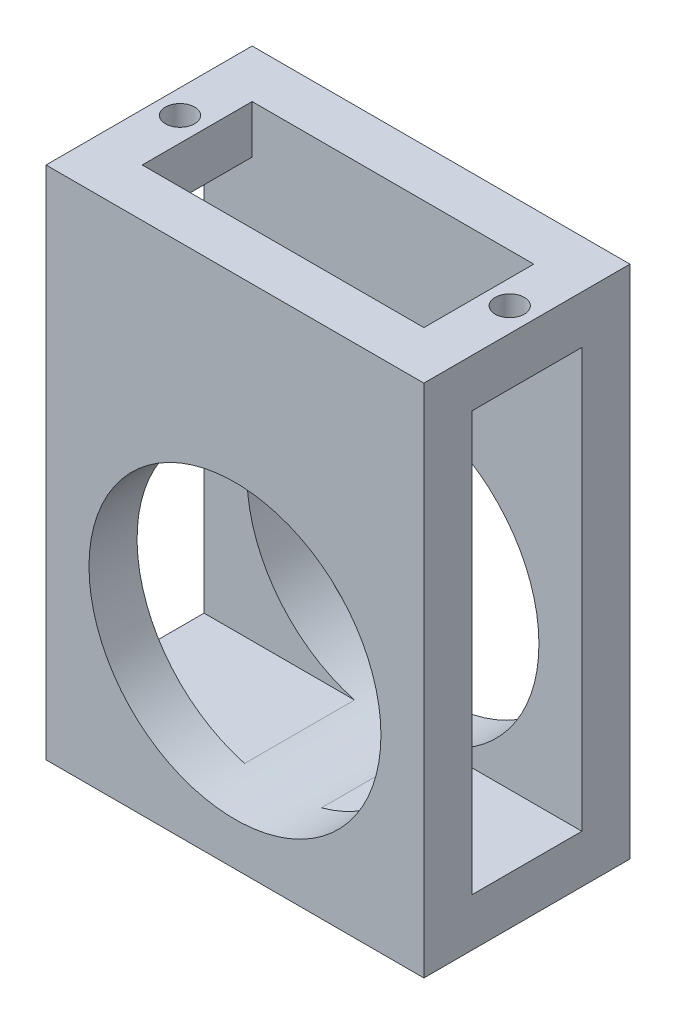
ISO-10303-21;
HEADER;
FILE_DESCRIPTION(('STEP AP214'),'2;1');
FILE_NAME('part.step','',(''),(''),'','','');
FILE_SCHEMA(('AUTOMOTIVE_DESIGN { 1 0 10303 214 1 1 1 1 }'));
ENDSEC;
DATA;
#1=APPLICATION_CONTEXT('core data for automotive mechanical design processes');
#2=APPLICATION_PROTOCOL_DEFINITION('international standard','automotive_design',2000,#1);
#3=PRODUCT_CONTEXT('',#1,'mechanical');
#4=PRODUCT('Part','Part','',(#3));
#5=PRODUCT_RELATED_PRODUCT_CATEGORY('part','',(#4));
#6=PRODUCT_DEFINITION_FORMATION('','',#4);
#7=PRODUCT_DEFINITION_CONTEXT('part definition',#1,'design');
#8=PRODUCT_DEFINITION('design','',#6,#7);
#9=PRODUCT_DEFINITION_SHAPE('','',#8);
#10=(LENGTH_UNIT() NAMED_UNIT(*) SI_UNIT(.MILLI.,.METRE.));
#11=(NAMED_UNIT(*) PLANE_ANGLE_UNIT() SI_UNIT($,.RADIAN.));
#12=(NAMED_UNIT(*) SI_UNIT($,.STERADIAN.) SOLID_ANGLE_UNIT());
#13=UNCERTAINTY_MEASURE_WITH_UNIT(LENGTH_MEASURE(1.E-05),#10,'distance_accuracy_value','');
#14=(GEOMETRIC_REPRESENTATION_CONTEXT(3) GLOBAL_UNCERTAINTY_ASSIGNED_CONTEXT((#13)) GLOBAL_UNIT_ASSIGNED_CONTEXT((#10,
#11,#12)) REPRESENTATION_CONTEXT('',''));
#15=CARTESIAN_POINT('',(0.,0.,0.));
#16=DIRECTION('',(0.,0.,1.));
#17=DIRECTION('',(1.,0.,0.));
#18=AXIS2_PLACEMENT_3D('',#15,#16,#17);
#19=CARTESIAN_POINT('',(-27.5,47.5,30.));
#20=DIRECTION('',(1.,0.,0.));
#21=DIRECTION('',(0.,1.,0.));
#22=AXIS2_PLACEMENT_3D('',#19,#20,#21);
#23=PLANE('',#22);
#24=DIRECTION('',(0.,0.,1.));
#25=VECTOR('',#24,1.);
#26=CARTESIAN_POINT('',(-27.5,40.5,30.));
#27=LINE('',#26,#25);
#28=CARTESIAN_POINT('',(-27.5,40.5,7.));
#29=VERTEX_POINT('',#28);
#30=CARTESIAN_POINT('',(-27.5,40.5,23.));
#31=VERTEX_POINT('',#30);
#32=EDGE_CURVE('E197',#29,#31,#27,.T.);
#33=ORIENTED_EDGE('',*,*,#32,.T.);
#34=DIRECTION('',(0.,-1.,0.));
#35=VECTOR('',#34,1.);
#36=CARTESIAN_POINT('',(-27.5,47.5,23.));
#37=LINE('',#36,#35);
#38=CARTESIAN_POINT('',(-27.5,-20.5,23.));
#39=VERTEX_POINT('',#38);
#40=EDGE_CURVE('E205',#31,#39,#37,.T.);
#41=ORIENTED_EDGE('',*,*,#40,.T.);
#42=DIRECTION('',(0.,0.,-1.));
#43=VECTOR('',#42,1.);
#44=CARTESIAN_POINT('',(-27.5,-20.5,30.));
#45=LINE('',#44,#43);
#46=CARTESIAN_POINT('',(-27.5,-20.5,6.99999999999999));
#47=VERTEX_POINT('',#46);
#48=EDGE_CURVE('E209',#39,#47,#45,.T.);
#49=ORIENTED_EDGE('',*,*,#48,.T.);
#50=DIRECTION('',(0.,1.,0.));
#51=VECTOR('',#50,1.);
#52=CARTESIAN_POINT('',(-27.5,47.5,7.));
#53=LINE('',#52,#51);
#54=EDGE_CURVE('E201',#47,#29,#53,.T.);
#55=ORIENTED_EDGE('',*,*,#54,.T.);
#56=EDGE_LOOP('',(#33,#41,#49,#55));
#57=FACE_BOUND('',#56,.T.);
#58=DIRECTION('',(0.,-1.,0.));
#59=VECTOR('',#58,1.);
#60=CARTESIAN_POINT('',(-27.5,47.5,0.));
#61=LINE('',#60,#59);
#62=CARTESIAN_POINT('',(-27.5,47.5,0.));
#63=VERTEX_POINT('',#62);
#64=CARTESIAN_POINT('',(-27.5,-27.5,0.));
#65=VERTEX_POINT('',#64);
#66=EDGE_CURVE('E246',#63,#65,#61,.T.);
#67=ORIENTED_EDGE('',*,*,#66,.T.);
#68=DIRECTION('',(0.,0.,-1.));
#69=VECTOR('',#68,1.);
#70=CARTESIAN_POINT('',(-27.5,-27.5,30.));
#71=LINE('',#70,#69);
#72=CARTESIAN_POINT('',(-27.5,-27.5,30.));
#73=VERTEX_POINT('',#72);
#74=EDGE_CURVE('E287',#73,#65,#71,.T.);
#75=ORIENTED_EDGE('',*,*,#74,.F.);
#76=DIRECTION('',(0.,-1.,0.));
#77=VECTOR('',#76,1.);
#78=CARTESIAN_POINT('',(-27.5,47.5,30.));
#79=LINE('',#78,#77);
#80=CARTESIAN_POINT('',(-27.5,47.5,30.));
#81=VERTEX_POINT('',#80);
#82=EDGE_CURVE('E250',#81,#73,#79,.T.);
#83=ORIENTED_EDGE('',*,*,#82,.F.);
#84=DIRECTION('',(0.,0.,-1.));
#85=VECTOR('',#84,1.);
#86=CARTESIAN_POINT('',(-27.5,47.5,30.));
#87=LINE('',#86,#85);
#88=EDGE_CURVE('E264',#81,#63,#87,.T.);
#89=ORIENTED_EDGE('',*,*,#88,.T.);
#90=EDGE_LOOP('',(#67,#75,#83,#89));
#91=FACE_BOUND('',#90,.T.);
#92=ADVANCED_FACE('F45',(#57,#91),#23,.F.);
#93=CARTESIAN_POINT('',(-27.5,-27.5,30.));
#94=DIRECTION('',(0.,1.,0.));
#95=DIRECTION('',(0.,0.,1.));
#96=AXIS2_PLACEMENT_3D('',#93,#94,#95);
#97=PLANE('',#96);
#98=DIRECTION('',(1.,0.,0.));
#99=VECTOR('',#98,1.);
#100=CARTESIAN_POINT('',(-27.5,-27.5,0.));
#101=LINE('',#100,#99);
#102=CARTESIAN_POINT('',(27.5,-27.5,0.));
#103=VERTEX_POINT('',#102);
#104=EDGE_CURVE('E268',#65,#103,#101,.T.);
#105=ORIENTED_EDGE('',*,*,#104,.T.);
#106=DIRECTION('',(0.,0.,-1.));
#107=VECTOR('',#106,1.);
#108=CARTESIAN_POINT('',(27.5,-27.5,30.));
#109=LINE('',#108,#107);
#110=CARTESIAN_POINT('',(27.5,-27.5,30.));
#111=VERTEX_POINT('',#110);
#112=EDGE_CURVE('E283',#111,#103,#109,.T.);
#113=ORIENTED_EDGE('',*,*,#112,.F.);
#114=DIRECTION('',(1.,0.,0.));
#115=VECTOR('',#114,1.);
#116=CARTESIAN_POINT('',(-27.5,-27.5,30.));
#117=LINE('',#116,#115);
#118=EDGE_CURVE('E254',#73,#111,#117,.T.);
#119=ORIENTED_EDGE('',*,*,#118,.F.);
#120=ORIENTED_EDGE('',*,*,#74,.T.);
#121=EDGE_LOOP('',(#105,#113,#119,#120));
#122=FACE_BOUND('',#121,.T.);
#123=ADVANCED_FACE('F344',(#122),#97,.F.);
#124=CARTESIAN_POINT('',(27.5,47.5,30.));
#125=DIRECTION('',(-1.,0.,0.));
#126=DIRECTION('',(0.,-1.,0.));
#127=AXIS2_PLACEMENT_3D('',#124,#125,#126);
#128=PLANE('',#127);
#129=DIRECTION('',(0.,0.,-1.));
#130=VECTOR('',#129,1.);
#131=CARTESIAN_POINT('',(27.5,-20.5,23.));
#132=LINE('',#131,#130);
#133=CARTESIAN_POINT('',(27.5,-20.5,23.));
#134=VERTEX_POINT('',#133);
#135=CARTESIAN_POINT('',(27.5,-20.5,6.99999999999999));
#136=VERTEX_POINT('',#135);
#137=EDGE_CURVE('E163',#134,#136,#132,.T.);
#138=ORIENTED_EDGE('',*,*,#137,.F.);
#139=DIRECTION('',(0.,-1.,0.));
#140=VECTOR('',#139,1.);
#141=CARTESIAN_POINT('',(27.5,40.5,23.));
#142=LINE('',#141,#140);
#143=CARTESIAN_POINT('',(27.5,40.5,23.));
#144=VERTEX_POINT('',#143);
#145=EDGE_CURVE('E70',#144,#134,#142,.T.);
#146=ORIENTED_EDGE('',*,*,#145,.F.);
#147=DIRECTION('',(0.,0.,1.));
#148=VECTOR('',#147,1.);
#149=CARTESIAN_POINT('',(27.5,40.5,23.));
#150=LINE('',#149,#148);
#151=CARTESIAN_POINT('',(27.5,40.5,7.));
#152=VERTEX_POINT('',#151);
#153=EDGE_CURVE('E172',#152,#144,#150,.T.);
#154=ORIENTED_EDGE('',*,*,#153,.F.);
#155=DIRECTION('',(0.,1.,0.));
#156=VECTOR('',#155,1.);
#157=CARTESIAN_POINT('',(27.5,40.5,7.));
#158=LINE('',#157,#156);
#159=EDGE_CURVE('E154',#136,#152,#158,.T.);
#160=ORIENTED_EDGE('',*,*,#159,.F.);
#161=EDGE_LOOP('',(#138,#146,#154,#160));
#162=FACE_BOUND('',#161,.T.);
#163=DIRECTION('',(0.,1.,0.));
#164=VECTOR('',#163,1.);
#165=CARTESIAN_POINT('',(27.5,47.5,0.));
#166=LINE('',#165,#164);
#167=CARTESIAN_POINT('',(27.5,47.5,0.));
#168=VERTEX_POINT('',#167);
#169=EDGE_CURVE('E271',#103,#168,#166,.T.);
#170=ORIENTED_EDGE('',*,*,#169,.T.);
#171=DIRECTION('',(0.,0.,-1.));
#172=VECTOR('',#171,1.);
#173=CARTESIAN_POINT('',(27.5,47.5,30.));
#174=LINE('',#173,#172);
#175=CARTESIAN_POINT('',(27.5,47.5,30.));
#176=VERTEX_POINT('',#175);
#177=EDGE_CURVE('E279',#176,#168,#174,.T.);
#178=ORIENTED_EDGE('',*,*,#177,.F.);
#179=DIRECTION('',(0.,1.,0.));
#180=VECTOR('',#179,1.);
#181=CARTESIAN_POINT('',(27.5,47.5,30.));
#182=LINE('',#181,#180);
#183=EDGE_CURVE('E258',#111,#176,#182,.T.);
#184=ORIENTED_EDGE('',*,*,#183,.F.);
#185=ORIENTED_EDGE('',*,*,#112,.T.);
#186=EDGE_LOOP('',(#170,#178,#184,#185));
#187=FACE_BOUND('',#186,.T.);
#188=ADVANCED_FACE('F169',(#162,#187),#128,.F.);
#189=CARTESIAN_POINT('',(-27.5,47.5,30.));
#190=DIRECTION('',(0.,-1.,0.));
#191=DIRECTION('',(0.,0.,-1.));
#192=AXIS2_PLACEMENT_3D('',#189,#190,#191);
#193=PLANE('',#192);
#194=CARTESIAN_POINT('',(-24.,47.5,14.));
#195=DIRECTION('',(0.,1.,0.));
#196=DIRECTION('',(0.,0.,1.));
#197=AXIS2_PLACEMENT_3D('',#194,#195,#196);
#198=CIRCLE('',#197,2.125);
#199=CARTESIAN_POINT('',(-24.,47.5,16.125));
#200=VERTEX_POINT('',#199);
#201=EDGE_CURVE('E301',#200,#200,#198,.T.);
#202=ORIENTED_EDGE('',*,*,#201,.F.);
#203=EDGE_LOOP('',(#202));
#204=FACE_BOUND('',#203,.T.);
#205=CARTESIAN_POINT('',(24.,47.5,14.));
#206=DIRECTION('',(0.,1.,0.));
#207=DIRECTION('',(0.,0.,1.));
#208=AXIS2_PLACEMENT_3D('',#205,#206,#207);
#209=CIRCLE('',#208,2.125);
#210=CARTESIAN_POINT('',(24.,47.5,16.125));
#211=VERTEX_POINT('',#210);
#212=EDGE_CURVE('E308',#211,#211,#209,.T.);
#213=ORIENTED_EDGE('',*,*,#212,.F.);
#214=EDGE_LOOP('',(#213));
#215=FACE_BOUND('',#214,.T.);
#216=DIRECTION('',(1.,0.,0.));
#217=VECTOR('',#216,1.);
#218=CARTESIAN_POINT('',(-20.5,47.5,23.));
#219=LINE('',#218,#217);
#220=CARTESIAN_POINT('',(-20.5,47.5,23.));
#221=VERTEX_POINT('',#220);
#222=CARTESIAN_POINT('',(20.5,47.5,23.));
#223=VERTEX_POINT('',#222);
#224=EDGE_CURVE('E217',#221,#223,#219,.T.);
#225=ORIENTED_EDGE('',*,*,#224,.F.);
#226=DIRECTION('',(0.,0.,1.));
#227=VECTOR('',#226,1.);
#228=CARTESIAN_POINT('',(-20.5,47.5,7.));
#229=LINE('',#228,#227);
#230=CARTESIAN_POINT('',(-20.5,47.5,7.));
#231=VERTEX_POINT('',#230);
#232=EDGE_CURVE('E213',#231,#221,#229,.T.);
#233=ORIENTED_EDGE('',*,*,#232,.F.);
#234=DIRECTION('',(-1.,0.,0.));
#235=VECTOR('',#234,1.);
#236=CARTESIAN_POINT('',(-20.5,47.5,7.));
#237=LINE('',#236,#235);
#238=CARTESIAN_POINT('',(20.5,47.5,7.));
#239=VERTEX_POINT('',#238);
#240=EDGE_CURVE('E225',#239,#231,#237,.T.);
#241=ORIENTED_EDGE('',*,*,#240,.F.);
#242=DIRECTION('',(0.,0.,-1.));
#243=VECTOR('',#242,1.);
#244=CARTESIAN_POINT('',(20.5,47.5,7.));
#245=LINE('',#244,#243);
#246=EDGE_CURVE('E221',#223,#239,#245,.T.);
#247=ORIENTED_EDGE('',*,*,#246,.F.);
#248=EDGE_LOOP('',(#225,#233,#241,#247));
#249=FACE_BOUND('',#248,.T.);
#250=DIRECTION('',(-1.,0.,0.));
#251=VECTOR('',#250,1.);
#252=CARTESIAN_POINT('',(-27.5,47.5,0.));
#253=LINE('',#252,#251);
#254=EDGE_CURVE('E255',#168,#63,#253,.T.);
#255=ORIENTED_EDGE('',*,*,#254,.T.);
#256=ORIENTED_EDGE('',*,*,#88,.F.);
#257=DIRECTION('',(-1.,0.,0.));
#258=VECTOR('',#257,1.);
#259=CARTESIAN_POINT('',(-27.5,47.5,30.));
#260=LINE('',#259,#258);
#261=EDGE_CURVE('E261',#176,#81,#260,.T.);
#262=ORIENTED_EDGE('',*,*,#261,.F.);
#263=ORIENTED_EDGE('',*,*,#177,.T.);
#264=EDGE_LOOP('',(#255,#256,#262,#263));
#265=FACE_BOUND('',#264,.T.);
#266=ADVANCED_FACE('F321',(#204,#215,#249,#265),#193,.F.);
#267=CARTESIAN_POINT('',(0.,0.,30.));
#268=DIRECTION('',(0.,0.,1.));
#269=DIRECTION('',(1.,0.,0.));
#270=AXIS2_PLACEMENT_3D('',#267,#268,#269);
#271=PLANE('',#270);
#272=CARTESIAN_POINT('',(0.,0.,30.));
#273=DIRECTION('',(0.,0.,1.));
#274=DIRECTION('',(1.,0.,0.));
#275=AXIS2_PLACEMENT_3D('',#272,#273,#274);
#276=CIRCLE('',#275,21.25);
#277=CARTESIAN_POINT('',(21.25,0.,30.));
#278=VERTEX_POINT('',#277);
#279=EDGE_CURVE('E233',#278,#278,#276,.T.);
#280=ORIENTED_EDGE('',*,*,#279,.F.);
#281=EDGE_LOOP('',(#280));
#282=FACE_BOUND('',#281,.T.);
#283=ORIENTED_EDGE('',*,*,#82,.T.);
#284=ORIENTED_EDGE('',*,*,#118,.T.);
#285=ORIENTED_EDGE('',*,*,#183,.T.);
#286=ORIENTED_EDGE('',*,*,#261,.T.);
#287=EDGE_LOOP('',(#283,#284,#285,#286));
#288=FACE_BOUND('',#287,.T.);
#289=ADVANCED_FACE('F324',(#282,#288),#271,.T.);
#290=CARTESIAN_POINT('',(0.,0.,0.));
#291=DIRECTION('',(0.,0.,1.));
#292=DIRECTION('',(1.,0.,0.));
#293=AXIS2_PLACEMENT_3D('',#290,#291,#292);
#294=PLANE('',#293);
#295=CARTESIAN_POINT('',(0.,0.,0.));
#296=DIRECTION('',(0.,0.,1.));
#297=DIRECTION('',(1.,0.,0.));
#298=AXIS2_PLACEMENT_3D('',#295,#296,#297);
#299=CIRCLE('',#298,21.25);
#300=CARTESIAN_POINT('',(21.25,0.,0.));
#301=VERTEX_POINT('',#300);
#302=EDGE_CURVE('E242',#301,#301,#299,.T.);
#303=ORIENTED_EDGE('',*,*,#302,.T.);
#304=EDGE_LOOP('',(#303));
#305=FACE_BOUND('',#304,.T.);
#306=ORIENTED_EDGE('',*,*,#66,.F.);
#307=ORIENTED_EDGE('',*,*,#254,.F.);
#308=ORIENTED_EDGE('',*,*,#169,.F.);
#309=ORIENTED_EDGE('',*,*,#104,.F.);
#310=EDGE_LOOP('',(#306,#307,#308,#309));
#311=FACE_BOUND('',#310,.T.);
#312=ADVANCED_FACE('F341',(#305,#311),#294,.F.);
#313=CARTESIAN_POINT('',(0.,0.,0.));
#314=DIRECTION('',(0.,0.,1.));
#315=DIRECTION('',(1.,0.,0.));
#316=AXIS2_PLACEMENT_3D('',#313,#314,#315);
#317=CYLINDRICAL_SURFACE('',#316,21.25);
#318=DIRECTION('',(0.,0.,1.));
#319=VECTOR('',#318,1.);
#320=CARTESIAN_POINT('',(-5.59575732139985,-20.5,0.));
#321=LINE('',#320,#319);
#322=CARTESIAN_POINT('',(-5.59575732139985,-20.5,6.99999999999999));
#323=VERTEX_POINT('',#322);
#324=CARTESIAN_POINT('',(-5.59575732139985,-20.5,23.));
#325=VERTEX_POINT('',#324);
#326=EDGE_CURVE('E54',#323,#325,#321,.T.);
#327=ORIENTED_EDGE('',*,*,#326,.T.);
#328=CARTESIAN_POINT('',(0.,0.,23.));
#329=DIRECTION('',(0.,0.,1.));
#330=DIRECTION('',(1.,0.,0.));
#331=AXIS2_PLACEMENT_3D('',#328,#329,#330);
#332=CIRCLE('',#331,21.25);
#333=CARTESIAN_POINT('',(5.59575732139985,-20.5,23.));
#334=VERTEX_POINT('',#333);
#335=EDGE_CURVE('E291',#325,#334,#332,.F.);
#336=ORIENTED_EDGE('',*,*,#335,.T.);
#337=DIRECTION('',(0.,0.,1.));
#338=VECTOR('',#337,1.);
#339=CARTESIAN_POINT('',(5.59575732139985,-20.5,0.));
#340=LINE('',#339,#338);
#341=CARTESIAN_POINT('',(5.59575732139985,-20.5,6.99999999999999));
#342=VERTEX_POINT('',#341);
#343=EDGE_CURVE('E11',#334,#342,#340,.F.);
#344=ORIENTED_EDGE('',*,*,#343,.T.);
#345=CARTESIAN_POINT('',(0.,0.,7.));
#346=DIRECTION('',(0.,0.,-1.));
#347=DIRECTION('',(-1.,0.,0.));
#348=AXIS2_PLACEMENT_3D('',#345,#346,#347);
#349=CIRCLE('',#348,21.25);
#350=EDGE_CURVE('E156',#342,#323,#349,.F.);
#351=ORIENTED_EDGE('',*,*,#350,.T.);
#352=EDGE_LOOP('',(#327,#336,#344,#351));
#353=FACE_BOUND('',#352,.T.);
#354=ORIENTED_EDGE('',*,*,#302,.F.);
#355=EDGE_LOOP('',(#354));
#356=FACE_BOUND('',#355,.T.);
#357=ORIENTED_EDGE('',*,*,#279,.T.);
#358=EDGE_LOOP('',(#357));
#359=FACE_BOUND('',#358,.T.);
#360=ADVANCED_FACE('F372',(#353,#356,#359),#317,.F.);
#361=CARTESIAN_POINT('',(-20.5,-12.5,23.));
#362=DIRECTION('',(0.,0.,1.));
#363=DIRECTION('',(1.,0.,0.));
#364=AXIS2_PLACEMENT_3D('',#361,#362,#363);
#365=PLANE('',#364);
#366=ORIENTED_EDGE('',*,*,#335,.F.);
#367=DIRECTION('',(1.,0.,0.));
#368=VECTOR('',#367,1.);
#369=CARTESIAN_POINT('',(-32.5,-20.5,23.));
#370=LINE('',#369,#368);
#371=EDGE_CURVE('E160',#39,#325,#370,.T.);
#372=ORIENTED_EDGE('',*,*,#371,.F.);
#373=ORIENTED_EDGE('',*,*,#40,.F.);
#374=DIRECTION('',(1.,0.,0.));
#375=VECTOR('',#374,1.);
#376=CARTESIAN_POINT('',(-32.5,40.5,23.));
#377=LINE('',#376,#375);
#378=CARTESIAN_POINT('',(-20.5,40.5,23.));
#379=VERTEX_POINT('',#378);
#380=EDGE_CURVE('E182',#31,#379,#377,.T.);
#381=ORIENTED_EDGE('',*,*,#380,.T.);
#382=DIRECTION('',(0.,1.,0.));
#383=VECTOR('',#382,1.);
#384=CARTESIAN_POINT('',(-20.5,-12.5,23.));
#385=LINE('',#384,#383);
#386=EDGE_CURVE('E229',#379,#221,#385,.T.);
#387=ORIENTED_EDGE('',*,*,#386,.T.);
#388=ORIENTED_EDGE('',*,*,#224,.T.);
#389=DIRECTION('',(0.,1.,0.));
#390=VECTOR('',#389,1.);
#391=CARTESIAN_POINT('',(20.5,-12.5,23.));
#392=LINE('',#391,#390);
#393=CARTESIAN_POINT('',(20.5,40.5,23.));
#394=VERTEX_POINT('',#393);
#395=EDGE_CURVE('E237',#394,#223,#392,.T.);
#396=ORIENTED_EDGE('',*,*,#395,.F.);
#397=EDGE_CURVE('E179',#394,#144,#377,.T.);
#398=ORIENTED_EDGE('',*,*,#397,.T.);
#399=ORIENTED_EDGE('',*,*,#145,.T.);
#400=EDGE_CURVE('E165',#334,#134,#370,.T.);
#401=ORIENTED_EDGE('',*,*,#400,.F.);
#402=EDGE_LOOP('',(#366,#372,#373,#381,#387,#388,#396,#398,#399,#401));
#403=FACE_BOUND('',#402,.T.);
#404=ADVANCED_FACE('F374',(#403),#365,.F.);
#405=CARTESIAN_POINT('',(-20.5,-12.5,7.));
#406=DIRECTION('',(0.,0.,-1.));
#407=DIRECTION('',(-1.,0.,0.));
#408=AXIS2_PLACEMENT_3D('',#405,#406,#407);
#409=PLANE('',#408);
#410=ORIENTED_EDGE('',*,*,#350,.F.);
#411=DIRECTION('',(1.,0.,0.));
#412=VECTOR('',#411,1.);
#413=CARTESIAN_POINT('',(-32.5,-20.5,6.99999999999999));
#414=LINE('',#413,#412);
#415=EDGE_CURVE('E150',#342,#136,#414,.T.);
#416=ORIENTED_EDGE('',*,*,#415,.T.);
#417=ORIENTED_EDGE('',*,*,#159,.T.);
#418=DIRECTION('',(1.,0.,0.));
#419=VECTOR('',#418,1.);
#420=CARTESIAN_POINT('',(-32.5,40.5,7.));
#421=LINE('',#420,#419);
#422=CARTESIAN_POINT('',(20.5,40.5,7.));
#423=VERTEX_POINT('',#422);
#424=EDGE_CURVE('E184',#423,#152,#421,.T.);
#425=ORIENTED_EDGE('',*,*,#424,.F.);
#426=DIRECTION('',(0.,1.,0.));
#427=VECTOR('',#426,1.);
#428=CARTESIAN_POINT('',(20.5,-12.5,7.));
#429=LINE('',#428,#427);
#430=EDGE_CURVE('E234',#423,#239,#429,.T.);
#431=ORIENTED_EDGE('',*,*,#430,.T.);
#432=ORIENTED_EDGE('',*,*,#240,.T.);
#433=DIRECTION('',(0.,1.,0.));
#434=VECTOR('',#433,1.);
#435=CARTESIAN_POINT('',(-20.5,-12.5,7.));
#436=LINE('',#435,#434);
#437=CARTESIAN_POINT('',(-20.5,40.5,7.));
#438=VERTEX_POINT('',#437);
#439=EDGE_CURVE('E230',#438,#231,#436,.T.);
#440=ORIENTED_EDGE('',*,*,#439,.F.);
#441=EDGE_CURVE('E183',#29,#438,#421,.T.);
#442=ORIENTED_EDGE('',*,*,#441,.F.);
#443=ORIENTED_EDGE('',*,*,#54,.F.);
#444=EDGE_CURVE('E62',#47,#323,#414,.T.);
#445=ORIENTED_EDGE('',*,*,#444,.T.);
#446=EDGE_LOOP('',(#410,#416,#417,#425,#431,#432,#440,#442,#443,#445));
#447=FACE_BOUND('',#446,.T.);
#448=ADVANCED_FACE('F152',(#447),#409,.F.);
#449=CARTESIAN_POINT('',(-20.5,-12.5,7.));
#450=DIRECTION('',(-1.,0.,0.));
#451=DIRECTION('',(0.,0.,1.));
#452=AXIS2_PLACEMENT_3D('',#449,#450,#451);
#453=PLANE('',#452);
#454=ORIENTED_EDGE('',*,*,#386,.F.);
#455=DIRECTION('',(0.,0.,-1.));
#456=VECTOR('',#455,1.);
#457=CARTESIAN_POINT('',(-20.5,40.5,7.));
#458=LINE('',#457,#456);
#459=EDGE_CURVE('E193',#379,#438,#458,.T.);
#460=ORIENTED_EDGE('',*,*,#459,.T.);
#461=ORIENTED_EDGE('',*,*,#439,.T.);
#462=ORIENTED_EDGE('',*,*,#232,.T.);
#463=EDGE_LOOP('',(#454,#460,#461,#462));
#464=FACE_BOUND('',#463,.T.);
#465=ADVANCED_FACE('F380',(#464),#453,.F.);
#466=CARTESIAN_POINT('',(20.5,-12.5,7.));
#467=DIRECTION('',(1.,0.,0.));
#468=DIRECTION('',(0.,0.,-1.));
#469=AXIS2_PLACEMENT_3D('',#466,#467,#468);
#470=PLANE('',#469);
#471=ORIENTED_EDGE('',*,*,#430,.F.);
#472=DIRECTION('',(0.,0.,1.));
#473=VECTOR('',#472,1.);
#474=CARTESIAN_POINT('',(20.5,40.5,7.));
#475=LINE('',#474,#473);
#476=EDGE_CURVE('E189',#423,#394,#475,.T.);
#477=ORIENTED_EDGE('',*,*,#476,.T.);
#478=ORIENTED_EDGE('',*,*,#395,.T.);
#479=ORIENTED_EDGE('',*,*,#246,.T.);
#480=EDGE_LOOP('',(#471,#477,#478,#479));
#481=FACE_BOUND('',#480,.T.);
#482=ADVANCED_FACE('F385',(#481),#470,.F.);
#483=CARTESIAN_POINT('',(-32.5,40.5,23.));
#484=DIRECTION('',(0.,1.,0.));
#485=DIRECTION('',(-1.,0.,0.));
#486=AXIS2_PLACEMENT_3D('',#483,#484,#485);
#487=PLANE('',#486);
#488=CARTESIAN_POINT('',(24.,40.5,14.));
#489=DIRECTION('',(0.,1.,0.));
#490=DIRECTION('',(-1.,0.,0.));
#491=AXIS2_PLACEMENT_3D('',#488,#489,#490);
#492=CIRCLE('',#491,2.125);
#493=CARTESIAN_POINT('',(21.875,40.5,14.));
#494=VERTEX_POINT('',#493);
#495=EDGE_CURVE('E48',#494,#494,#492,.T.);
#496=ORIENTED_EDGE('',*,*,#495,.T.);
#497=EDGE_LOOP('',(#496));
#498=FACE_BOUND('',#497,.T.);
#499=ORIENTED_EDGE('',*,*,#424,.T.);
#500=ORIENTED_EDGE('',*,*,#153,.T.);
#501=ORIENTED_EDGE('',*,*,#397,.F.);
#502=ORIENTED_EDGE('',*,*,#476,.F.);
#503=EDGE_LOOP('',(#499,#500,#501,#502));
#504=FACE_BOUND('',#503,.T.);
#505=ADVANCED_FACE('F431',(#498,#504),#487,.F.);
#506=CARTESIAN_POINT('',(-32.5,-20.5,23.));
#507=DIRECTION('',(0.,-1.,0.));
#508=DIRECTION('',(1.,0.,0.));
#509=AXIS2_PLACEMENT_3D('',#506,#507,#508);
#510=PLANE('',#509);
#511=ORIENTED_EDGE('',*,*,#400,.T.);
#512=ORIENTED_EDGE('',*,*,#137,.T.);
#513=ORIENTED_EDGE('',*,*,#415,.F.);
#514=ORIENTED_EDGE('',*,*,#343,.F.);
#515=EDGE_LOOP('',(#511,#512,#513,#514));
#516=FACE_BOUND('',#515,.T.);
#517=ADVANCED_FACE('F164',(#516),#510,.F.);
#518=ORIENTED_EDGE('',*,*,#371,.T.);
#519=ORIENTED_EDGE('',*,*,#326,.F.);
#520=ORIENTED_EDGE('',*,*,#444,.F.);
#521=ORIENTED_EDGE('',*,*,#48,.F.);
#522=EDGE_LOOP('',(#518,#519,#520,#521));
#523=FACE_BOUND('',#522,.T.);
#524=ADVANCED_FACE('F370',(#523),#510,.F.);
#525=CARTESIAN_POINT('',(-24.,40.5,14.));
#526=DIRECTION('',(0.,1.,0.));
#527=DIRECTION('',(-1.,0.,0.));
#528=AXIS2_PLACEMENT_3D('',#525,#526,#527);
#529=CIRCLE('',#528,2.125);
#530=CARTESIAN_POINT('',(-26.125,40.5,14.));
#531=VERTEX_POINT('',#530);
#532=EDGE_CURVE('E298',#531,#531,#529,.T.);
#533=ORIENTED_EDGE('',*,*,#532,.T.);
#534=EDGE_LOOP('',(#533));
#535=FACE_BOUND('',#534,.T.);
#536=ORIENTED_EDGE('',*,*,#441,.T.);
#537=ORIENTED_EDGE('',*,*,#459,.F.);
#538=ORIENTED_EDGE('',*,*,#380,.F.);
#539=ORIENTED_EDGE('',*,*,#32,.F.);
#540=EDGE_LOOP('',(#536,#537,#538,#539));
#541=FACE_BOUND('',#540,.T.);
#542=ADVANCED_FACE('F361',(#535,#541),#487,.F.);
#543=CARTESIAN_POINT('',(-24.,37.5,14.));
#544=DIRECTION('',(0.,1.,0.));
#545=DIRECTION('',(0.,0.,1.));
#546=AXIS2_PLACEMENT_3D('',#543,#544,#545);
#547=CYLINDRICAL_SURFACE('',#546,2.125);
#548=ORIENTED_EDGE('',*,*,#201,.T.);
#549=EDGE_LOOP('',(#548));
#550=FACE_BOUND('',#549,.T.);
#551=ORIENTED_EDGE('',*,*,#532,.F.);
#552=EDGE_LOOP('',(#551));
#553=FACE_BOUND('',#552,.T.);
#554=ADVANCED_FACE('F445',(#550,#553),#547,.F.);
#555=CARTESIAN_POINT('',(24.,37.5,14.));
#556=DIRECTION('',(0.,1.,0.));
#557=DIRECTION('',(0.,0.,1.));
#558=AXIS2_PLACEMENT_3D('',#555,#556,#557);
#559=CYLINDRICAL_SURFACE('',#558,2.125);
#560=ORIENTED_EDGE('',*,*,#212,.T.);
#561=EDGE_LOOP('',(#560));
#562=FACE_BOUND('',#561,.T.);
#563=ORIENTED_EDGE('',*,*,#495,.F.);
#564=EDGE_LOOP('',(#563));
#565=FACE_BOUND('',#564,.T.);
#566=ADVANCED_FACE('F318',(#562,#565),#559,.F.);
#567=CLOSED_SHELL('',(#92,#123,#188,#266,#289,#312,#360,#404,#448,#465,#482,#505,#517,#524,#542,
#554,#566));
#568=MANIFOLD_SOLID_BREP('B2',#567);
#569=ADVANCED_BREP_SHAPE_REPRESENTATION('',(#18,#568),#14);
#570=SHAPE_DEFINITION_REPRESENTATION(#9,#569);
ENDSEC;
END-ISO-10303-21;
